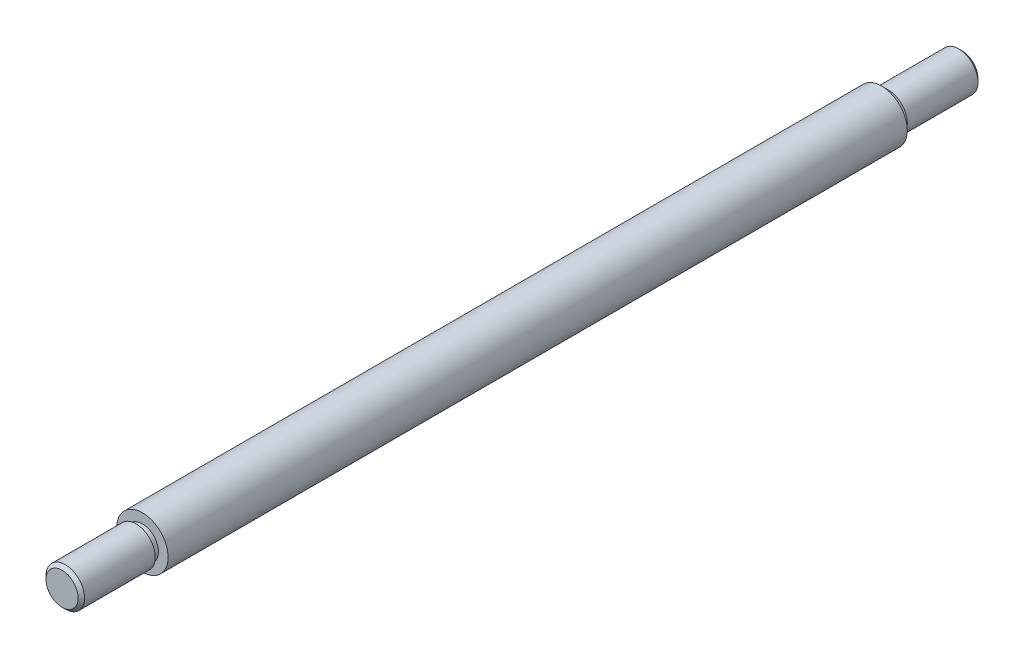
ISO-10303-21;
HEADER;
FILE_DESCRIPTION(('STEP AP214'),'2;1');
FILE_NAME('part.step','',(''),(''),'','','');
FILE_SCHEMA(('AUTOMOTIVE_DESIGN { 1 0 10303 214 1 1 1 1 }'));
ENDSEC;
DATA;
#1=APPLICATION_CONTEXT('core data for automotive mechanical design processes');
#2=APPLICATION_PROTOCOL_DEFINITION('international standard','automotive_design',2000,#1);
#3=PRODUCT_CONTEXT('',#1,'mechanical');
#4=PRODUCT('Part','Part','',(#3));
#5=PRODUCT_RELATED_PRODUCT_CATEGORY('part','',(#4));
#6=PRODUCT_DEFINITION_FORMATION('','',#4);
#7=PRODUCT_DEFINITION_CONTEXT('part definition',#1,'design');
#8=PRODUCT_DEFINITION('design','',#6,#7);
#9=PRODUCT_DEFINITION_SHAPE('','',#8);
#10=(LENGTH_UNIT() NAMED_UNIT(*) SI_UNIT(.MILLI.,.METRE.));
#11=(NAMED_UNIT(*) PLANE_ANGLE_UNIT() SI_UNIT($,.RADIAN.));
#12=(NAMED_UNIT(*) SI_UNIT($,.STERADIAN.) SOLID_ANGLE_UNIT());
#13=UNCERTAINTY_MEASURE_WITH_UNIT(LENGTH_MEASURE(1.E-05),#10,'distance_accuracy_value','');
#14=(GEOMETRIC_REPRESENTATION_CONTEXT(3) GLOBAL_UNCERTAINTY_ASSIGNED_CONTEXT((#13)) GLOBAL_UNIT_ASSIGNED_CONTEXT((#10,
#11,#12)) REPRESENTATION_CONTEXT('',''));
#15=CARTESIAN_POINT('',(0.,0.,0.));
#16=DIRECTION('',(0.,0.,1.));
#17=DIRECTION('',(1.,0.,0.));
#18=AXIS2_PLACEMENT_3D('',#15,#16,#17);
#19=CARTESIAN_POINT('',(0.,0.,-140.));
#20=DIRECTION('',(0.,0.,1.));
#21=DIRECTION('',(1.,0.,0.));
#22=AXIS2_PLACEMENT_3D('',#19,#20,#21);
#23=PLANE('',#22);
#24=CARTESIAN_POINT('',(0.,0.,-139.999999999986));
#25=DIRECTION('',(0.,0.,1.));
#26=DIRECTION('',(1.,0.,0.));
#27=AXIS2_PLACEMENT_3D('',#24,#25,#26);
#28=CIRCLE('',#27,4.99999999999545);
#29=CARTESIAN_POINT('',(4.99999999999545,0.,-139.999999999986));
#30=VERTEX_POINT('',#29);
#31=EDGE_CURVE('E18',#30,#30,#28,.T.);
#32=ORIENTED_EDGE('',*,*,#31,.F.);
#33=EDGE_LOOP('',(#32));
#34=FACE_BOUND('',#33,.T.);
#35=ADVANCED_FACE('F15',(#34),#23,.F.);
#36=CARTESIAN_POINT('',(0.,0.,140.));
#37=DIRECTION('',(0.,0.,1.));
#38=DIRECTION('',(1.,0.,0.));
#39=AXIS2_PLACEMENT_3D('',#36,#37,#38);
#40=PLANE('',#39);
#41=CARTESIAN_POINT('',(0.,0.,139.999999999986));
#42=DIRECTION('',(0.,0.,-1.));
#43=DIRECTION('',(-1.,0.,0.));
#44=AXIS2_PLACEMENT_3D('',#41,#42,#43);
#45=CIRCLE('',#44,4.99999999999545);
#46=CARTESIAN_POINT('',(-4.99999999999545,0.,139.999999999986));
#47=VERTEX_POINT('',#46);
#48=EDGE_CURVE('E50',#47,#47,#45,.T.);
#49=ORIENTED_EDGE('',*,*,#48,.F.);
#50=EDGE_LOOP('',(#49));
#51=FACE_BOUND('',#50,.T.);
#52=ADVANCED_FACE('F63',(#51),#40,.T.);
#53=CARTESIAN_POINT('',(0.,0.,-138.999999999896));
#54=DIRECTION('',(0.,0.,1.));
#55=DIRECTION('',(1.,0.,0.));
#56=AXIS2_PLACEMENT_3D('',#53,#54,#55);
#57=CONICAL_SURFACE('',#56,6.00000000008549,0.785398163397448);
#58=ORIENTED_EDGE('',*,*,#31,.T.);
#59=EDGE_LOOP('',(#58));
#60=FACE_BOUND('',#59,.T.);
#61=CARTESIAN_POINT('',(0.,0.,-139.));
#62=DIRECTION('',(0.,0.,-1.));
#63=DIRECTION('',(-1.,0.,0.));
#64=AXIS2_PLACEMENT_3D('',#61,#62,#63);
#65=CIRCLE('',#64,6.);
#66=CARTESIAN_POINT('',(-6.,0.,-139.));
#67=VERTEX_POINT('',#66);
#68=EDGE_CURVE('E52',#67,#67,#65,.F.);
#69=ORIENTED_EDGE('',*,*,#68,.F.);
#70=EDGE_LOOP('',(#69));
#71=FACE_BOUND('',#70,.T.);
#72=ADVANCED_FACE('F59',(#60,#71),#57,.T.);
#73=CARTESIAN_POINT('',(0.,0.,138.999999999896));
#74=DIRECTION('',(0.,0.,-1.));
#75=DIRECTION('',(-1.,0.,0.));
#76=AXIS2_PLACEMENT_3D('',#73,#74,#75);
#77=CONICAL_SURFACE('',#76,6.00000000008549,0.785398163397448);
#78=ORIENTED_EDGE('',*,*,#48,.T.);
#79=EDGE_LOOP('',(#78));
#80=FACE_BOUND('',#79,.T.);
#81=CARTESIAN_POINT('',(0.,0.,139.));
#82=DIRECTION('',(0.,0.,-1.));
#83=DIRECTION('',(-1.,0.,0.));
#84=AXIS2_PLACEMENT_3D('',#81,#82,#83);
#85=CIRCLE('',#84,6.);
#86=CARTESIAN_POINT('',(-6.,0.,139.));
#87=VERTEX_POINT('',#86);
#88=EDGE_CURVE('E49',#87,#87,#85,.T.);
#89=ORIENTED_EDGE('',*,*,#88,.F.);
#90=EDGE_LOOP('',(#89));
#91=FACE_BOUND('',#90,.T.);
#92=ADVANCED_FACE('F107',(#80,#91),#77,.T.);
#93=CARTESIAN_POINT('',(0.,0.,-140.));
#94=DIRECTION('',(0.,0.,-1.));
#95=DIRECTION('',(-1.,0.,0.));
#96=AXIS2_PLACEMENT_3D('',#93,#94,#95);
#97=CYLINDRICAL_SURFACE('',#96,6.);
#98=ORIENTED_EDGE('',*,*,#68,.T.);
#99=EDGE_LOOP('',(#98));
#100=FACE_BOUND('',#99,.T.);
#101=CARTESIAN_POINT('',(0.,0.,-117.));
#102=DIRECTION('',(0.,0.,-1.));
#103=DIRECTION('',(-1.,0.,0.));
#104=AXIS2_PLACEMENT_3D('',#101,#102,#103);
#105=CIRCLE('',#104,6.);
#106=CARTESIAN_POINT('',(-6.,0.,-117.));
#107=VERTEX_POINT('',#106);
#108=EDGE_CURVE('E47',#107,#107,#105,.F.);
#109=ORIENTED_EDGE('',*,*,#108,.F.);
#110=EDGE_LOOP('',(#109));
#111=FACE_BOUND('',#110,.T.);
#112=ADVANCED_FACE('F103',(#100,#111),#97,.T.);
#113=CARTESIAN_POINT('',(0.,0.,140.));
#114=DIRECTION('',(0.,0.,-1.));
#115=DIRECTION('',(-1.,0.,0.));
#116=AXIS2_PLACEMENT_3D('',#113,#114,#115);
#117=CYLINDRICAL_SURFACE('',#116,6.);
#118=ORIENTED_EDGE('',*,*,#88,.T.);
#119=EDGE_LOOP('',(#118));
#120=FACE_BOUND('',#119,.T.);
#121=CARTESIAN_POINT('',(0.,0.,117.));
#122=DIRECTION('',(0.,0.,-1.));
#123=DIRECTION('',(-1.,0.,0.));
#124=AXIS2_PLACEMENT_3D('',#121,#122,#123);
#125=CIRCLE('',#124,6.);
#126=CARTESIAN_POINT('',(-6.,0.,117.));
#127=VERTEX_POINT('',#126);
#128=EDGE_CURVE('E44',#127,#127,#125,.F.);
#129=ORIENTED_EDGE('',*,*,#128,.T.);
#130=EDGE_LOOP('',(#129));
#131=FACE_BOUND('',#130,.T.);
#132=ADVANCED_FACE('F99',(#120,#131),#117,.T.);
#133=CARTESIAN_POINT('',(0.,0.,-117.));
#134=DIRECTION('',(0.,0.,1.));
#135=DIRECTION('',(1.,0.,0.));
#136=AXIS2_PLACEMENT_3D('',#133,#134,#135);
#137=PLANE('',#136);
#138=CARTESIAN_POINT('',(0.,0.,-117.));
#139=DIRECTION('',(0.,0.,1.));
#140=DIRECTION('',(1.,0.,0.));
#141=AXIS2_PLACEMENT_3D('',#138,#139,#140);
#142=CIRCLE('',#141,5.);
#143=CARTESIAN_POINT('',(5.,0.,-117.));
#144=VERTEX_POINT('',#143);
#145=EDGE_CURVE('E41',#144,#144,#142,.T.);
#146=ORIENTED_EDGE('',*,*,#145,.F.);
#147=EDGE_LOOP('',(#146));
#148=FACE_BOUND('',#147,.T.);
#149=ORIENTED_EDGE('',*,*,#108,.T.);
#150=EDGE_LOOP('',(#149));
#151=FACE_BOUND('',#150,.T.);
#152=ADVANCED_FACE('F95',(#148,#151),#137,.T.);
#153=CARTESIAN_POINT('',(0.,0.,117.));
#154=DIRECTION('',(0.,0.,1.));
#155=DIRECTION('',(1.,0.,0.));
#156=AXIS2_PLACEMENT_3D('',#153,#154,#155);
#157=PLANE('',#156);
#158=CARTESIAN_POINT('',(0.,0.,117.));
#159=DIRECTION('',(0.,0.,1.));
#160=DIRECTION('',(1.,0.,0.));
#161=AXIS2_PLACEMENT_3D('',#158,#159,#160);
#162=CIRCLE('',#161,5.);
#163=CARTESIAN_POINT('',(5.,0.,117.));
#164=VERTEX_POINT('',#163);
#165=EDGE_CURVE('E38',#164,#164,#162,.F.);
#166=ORIENTED_EDGE('',*,*,#165,.F.);
#167=EDGE_LOOP('',(#166));
#168=FACE_BOUND('',#167,.T.);
#169=ORIENTED_EDGE('',*,*,#128,.F.);
#170=EDGE_LOOP('',(#169));
#171=FACE_BOUND('',#170,.T.);
#172=ADVANCED_FACE('F91',(#168,#171),#157,.F.);
#173=CARTESIAN_POINT('',(0.,0.,-115.));
#174=DIRECTION('',(0.,0.,1.));
#175=DIRECTION('',(1.,0.,0.));
#176=AXIS2_PLACEMENT_3D('',#173,#174,#175);
#177=CYLINDRICAL_SURFACE('',#176,5.);
#178=CARTESIAN_POINT('',(0.,0.,-115.));
#179=DIRECTION('',(0.,0.,1.));
#180=DIRECTION('',(1.,0.,0.));
#181=AXIS2_PLACEMENT_3D('',#178,#179,#180);
#182=CIRCLE('',#181,5.);
#183=CARTESIAN_POINT('',(5.,0.,-115.));
#184=VERTEX_POINT('',#183);
#185=EDGE_CURVE('E35',#184,#184,#182,.F.);
#186=ORIENTED_EDGE('',*,*,#185,.T.);
#187=EDGE_LOOP('',(#186));
#188=FACE_BOUND('',#187,.T.);
#189=ORIENTED_EDGE('',*,*,#145,.T.);
#190=EDGE_LOOP('',(#189));
#191=FACE_BOUND('',#190,.T.);
#192=ADVANCED_FACE('F87',(#188,#191),#177,.T.);
#193=CARTESIAN_POINT('',(0.,0.,115.));
#194=DIRECTION('',(0.,0.,1.));
#195=DIRECTION('',(1.,0.,0.));
#196=AXIS2_PLACEMENT_3D('',#193,#194,#195);
#197=CYLINDRICAL_SURFACE('',#196,5.);
#198=CARTESIAN_POINT('',(0.,0.,115.));
#199=DIRECTION('',(0.,0.,1.));
#200=DIRECTION('',(1.,0.,0.));
#201=AXIS2_PLACEMENT_3D('',#198,#199,#200);
#202=CIRCLE('',#201,5.);
#203=CARTESIAN_POINT('',(5.,0.,115.));
#204=VERTEX_POINT('',#203);
#205=EDGE_CURVE('E27',#204,#204,#202,.F.);
#206=ORIENTED_EDGE('',*,*,#205,.F.);
#207=EDGE_LOOP('',(#206));
#208=FACE_BOUND('',#207,.T.);
#209=ORIENTED_EDGE('',*,*,#165,.T.);
#210=EDGE_LOOP('',(#209));
#211=FACE_BOUND('',#210,.T.);
#212=ADVANCED_FACE('F83',(#208,#211),#197,.T.);
#213=CARTESIAN_POINT('',(0.,0.,-115.));
#214=DIRECTION('',(0.,0.,1.));
#215=DIRECTION('',(1.,0.,0.));
#216=AXIS2_PLACEMENT_3D('',#213,#214,#215);
#217=PLANE('',#216);
#218=ORIENTED_EDGE('',*,*,#185,.F.);
#219=EDGE_LOOP('',(#218));
#220=FACE_BOUND('',#219,.T.);
#221=CARTESIAN_POINT('',(0.,0.,-115.));
#222=DIRECTION('',(0.,0.,1.));
#223=DIRECTION('',(1.,0.,0.));
#224=AXIS2_PLACEMENT_3D('',#221,#222,#223);
#225=CIRCLE('',#224,8.);
#226=CARTESIAN_POINT('',(8.,0.,-115.));
#227=VERTEX_POINT('',#226);
#228=EDGE_CURVE('E22',#227,#227,#225,.T.);
#229=ORIENTED_EDGE('',*,*,#228,.F.);
#230=EDGE_LOOP('',(#229));
#231=FACE_BOUND('',#230,.T.);
#232=ADVANCED_FACE('F76',(#220,#231),#217,.F.);
#233=CARTESIAN_POINT('',(0.,0.,115.));
#234=DIRECTION('',(0.,0.,1.));
#235=DIRECTION('',(1.,0.,0.));
#236=AXIS2_PLACEMENT_3D('',#233,#234,#235);
#237=PLANE('',#236);
#238=ORIENTED_EDGE('',*,*,#205,.T.);
#239=EDGE_LOOP('',(#238));
#240=FACE_BOUND('',#239,.T.);
#241=CARTESIAN_POINT('',(0.,0.,115.));
#242=DIRECTION('',(0.,0.,1.));
#243=DIRECTION('',(1.,0.,0.));
#244=AXIS2_PLACEMENT_3D('',#241,#242,#243);
#245=CIRCLE('',#244,8.);
#246=CARTESIAN_POINT('',(8.,0.,115.));
#247=VERTEX_POINT('',#246);
#248=EDGE_CURVE('E10',#247,#247,#245,.F.);
#249=ORIENTED_EDGE('',*,*,#248,.F.);
#250=EDGE_LOOP('',(#249));
#251=FACE_BOUND('',#250,.T.);
#252=ADVANCED_FACE('F71',(#240,#251),#237,.T.);
#253=CARTESIAN_POINT('',(0.,0.,0.));
#254=DIRECTION('',(0.,0.,1.));
#255=DIRECTION('',(1.,0.,0.));
#256=AXIS2_PLACEMENT_3D('',#253,#254,#255);
#257=CYLINDRICAL_SURFACE('',#256,8.);
#258=ORIENTED_EDGE('',*,*,#248,.T.);
#259=EDGE_LOOP('',(#258));
#260=FACE_BOUND('',#259,.T.);
#261=ORIENTED_EDGE('',*,*,#228,.T.);
#262=EDGE_LOOP('',(#261));
#263=FACE_BOUND('',#262,.T.);
#264=ADVANCED_FACE('F69',(#260,#263),#257,.T.);
#265=CLOSED_SHELL('',(#35,#52,#72,#92,#112,#132,#152,#172,#192,#212,#232,#252,#264));
#266=MANIFOLD_SOLID_BREP('B1',#265);
#267=ADVANCED_BREP_SHAPE_REPRESENTATION('',(#18,#266),#14);
#268=SHAPE_DEFINITION_REPRESENTATION(#9,#267);
ENDSEC;
END-ISO-10303-21;
